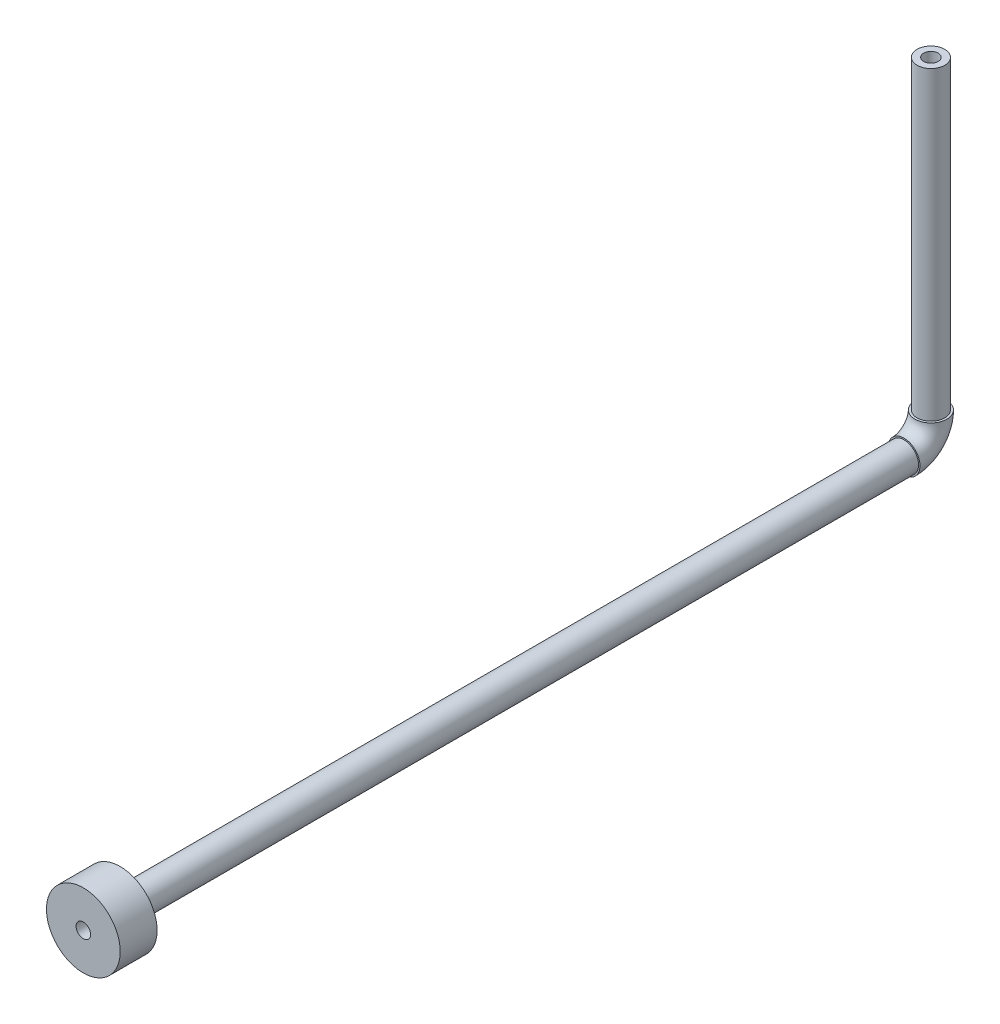
ISO-10303-21;
HEADER;
FILE_DESCRIPTION(('STEP AP214'),'2;1');
FILE_NAME('part.step','',(''),(''),'','','');
FILE_SCHEMA(('AUTOMOTIVE_DESIGN { 1 0 10303 214 1 1 1 1 }'));
ENDSEC;
DATA;
#1=APPLICATION_CONTEXT('core data for automotive mechanical design processes');
#2=APPLICATION_PROTOCOL_DEFINITION('international standard','automotive_design',2000,#1);
#3=PRODUCT_CONTEXT('',#1,'mechanical');
#4=PRODUCT('Part','Part','',(#3));
#5=PRODUCT_RELATED_PRODUCT_CATEGORY('part','',(#4));
#6=PRODUCT_DEFINITION_FORMATION('','',#4);
#7=PRODUCT_DEFINITION_CONTEXT('part definition',#1,'design');
#8=PRODUCT_DEFINITION('design','',#6,#7);
#9=PRODUCT_DEFINITION_SHAPE('','',#8);
#10=(LENGTH_UNIT() NAMED_UNIT(*) SI_UNIT(.MILLI.,.METRE.));
#11=(NAMED_UNIT(*) PLANE_ANGLE_UNIT() SI_UNIT($,.RADIAN.));
#12=(NAMED_UNIT(*) SI_UNIT($,.STERADIAN.) SOLID_ANGLE_UNIT());
#13=UNCERTAINTY_MEASURE_WITH_UNIT(LENGTH_MEASURE(1.E-05),#10,'distance_accuracy_value','');
#14=(GEOMETRIC_REPRESENTATION_CONTEXT(3) GLOBAL_UNCERTAINTY_ASSIGNED_CONTEXT((#13)) GLOBAL_UNIT_ASSIGNED_CONTEXT((#10,
#11,#12)) REPRESENTATION_CONTEXT('',''));
#15=CARTESIAN_POINT('',(0.,0.,0.));
#16=DIRECTION('',(0.,0.,1.));
#17=DIRECTION('',(1.,0.,0.));
#18=AXIS2_PLACEMENT_3D('',#15,#16,#17);
#19=CARTESIAN_POINT('',(563.692704421741,240.987141462231,-291.844137163047));
#20=DIRECTION('',(0.,1.,0.));
#21=DIRECTION('',(-1.,0.,0.));
#22=AXIS2_PLACEMENT_3D('',#19,#20,#21);
#23=PLANE('',#22);
#24=CARTESIAN_POINT('',(563.692704421741,240.987141462231,-291.844137163047));
#25=DIRECTION('',(0.,1.,0.));
#26=DIRECTION('',(-1.,0.,0.));
#27=AXIS2_PLACEMENT_3D('',#24,#25,#26);
#28=CIRCLE('',#27,5.49999999999996);
#29=CARTESIAN_POINT('',(563.692704421741,240.987141462231,-297.344137163047));
#30=VERTEX_POINT('',#29);
#31=EDGE_CURVE('E55',#30,#30,#28,.T.);
#32=ORIENTED_EDGE('',*,*,#31,.T.);
#33=EDGE_LOOP('',(#32));
#34=FACE_BOUND('',#33,.T.);
#35=CARTESIAN_POINT('',(563.692704421741,240.987141462233,-291.844137163047));
#36=DIRECTION('',(0.,1.,0.));
#37=DIRECTION('',(0.,0.,1.));
#38=AXIS2_PLACEMENT_3D('',#35,#36,#37);
#39=CIRCLE('',#38,4.76250000000001);
#40=CARTESIAN_POINT('',(563.692704421741,240.987141462233,-287.081637163047));
#41=VERTEX_POINT('',#40);
#42=EDGE_CURVE('E69',#41,#41,#39,.T.);
#43=ORIENTED_EDGE('',*,*,#42,.F.);
#44=EDGE_LOOP('',(#43));
#45=FACE_BOUND('',#44,.T.);
#46=ADVANCED_FACE('F35',(#34,#45),#23,.T.);
#47=CARTESIAN_POINT('',(563.692704421741,231.718004299184,-12.7));
#48=DIRECTION('',(0.,0.,1.));
#49=DIRECTION('',(1.,0.,0.));
#50=AXIS2_PLACEMENT_3D('',#47,#48,#49);
#51=CYLINDRICAL_SURFACE('',#50,12.7);
#52=CARTESIAN_POINT('',(563.692704421741,231.718004299184,-12.7));
#53=DIRECTION('',(0.,0.,1.));
#54=DIRECTION('',(1.,0.,0.));
#55=AXIS2_PLACEMENT_3D('',#52,#53,#54);
#56=CIRCLE('',#55,12.7);
#57=CARTESIAN_POINT('',(576.392704421741,231.718004299184,-12.7));
#58=VERTEX_POINT('',#57);
#59=EDGE_CURVE('E10',#58,#58,#56,.T.);
#60=ORIENTED_EDGE('',*,*,#59,.T.);
#61=EDGE_LOOP('',(#60));
#62=FACE_BOUND('',#61,.T.);
#63=CARTESIAN_POINT('',(563.692704421741,231.718004299184,0.));
#64=DIRECTION('',(0.,0.,1.));
#65=DIRECTION('',(1.,0.,0.));
#66=AXIS2_PLACEMENT_3D('',#63,#64,#65);
#67=CIRCLE('',#66,12.7);
#68=CARTESIAN_POINT('',(576.392704421741,231.718004299184,0.));
#69=VERTEX_POINT('',#68);
#70=EDGE_CURVE('E39',#69,#69,#67,.T.);
#71=ORIENTED_EDGE('',*,*,#70,.F.);
#72=EDGE_LOOP('',(#71));
#73=FACE_BOUND('',#72,.T.);
#74=ADVANCED_FACE('F37',(#62,#73),#51,.T.);
#75=CARTESIAN_POINT('',(563.692704421741,231.718004299184,-12.7));
#76=DIRECTION('',(0.,0.,1.));
#77=DIRECTION('',(1.,0.,0.));
#78=AXIS2_PLACEMENT_3D('',#75,#76,#77);
#79=PLANE('',#78);
#80=CARTESIAN_POINT('',(563.692704421741,231.718004299184,-12.7));
#81=DIRECTION('',(0.,0.,1.));
#82=DIRECTION('',(1.,0.,0.));
#83=AXIS2_PLACEMENT_3D('',#80,#81,#82);
#84=CIRCLE('',#83,5.00000000000005);
#85=CARTESIAN_POINT('',(568.692704421741,231.718004299184,-12.7));
#86=VERTEX_POINT('',#85);
#87=EDGE_CURVE('E46',#86,#86,#84,.T.);
#88=ORIENTED_EDGE('',*,*,#87,.T.);
#89=EDGE_LOOP('',(#88));
#90=FACE_BOUND('',#89,.T.);
#91=ORIENTED_EDGE('',*,*,#59,.F.);
#92=EDGE_LOOP('',(#91));
#93=FACE_BOUND('',#92,.T.);
#94=ADVANCED_FACE('F103',(#90,#93),#79,.F.);
#95=CARTESIAN_POINT('',(563.692704421741,231.718004299184,0.));
#96=DIRECTION('',(0.,0.,1.));
#97=DIRECTION('',(1.,0.,0.));
#98=AXIS2_PLACEMENT_3D('',#95,#96,#97);
#99=PLANE('',#98);
#100=ORIENTED_EDGE('',*,*,#70,.T.);
#101=EDGE_LOOP('',(#100));
#102=FACE_BOUND('',#101,.T.);
#103=CARTESIAN_POINT('',(563.692704421741,231.718004299184,0.));
#104=DIRECTION('',(0.,0.,1.));
#105=DIRECTION('',(1.,0.,0.));
#106=AXIS2_PLACEMENT_3D('',#103,#104,#105);
#107=CIRCLE('',#106,2.49999999999992);
#108=CARTESIAN_POINT('',(566.192704421741,231.718004299184,0.));
#109=VERTEX_POINT('',#108);
#110=EDGE_CURVE('E54',#109,#109,#107,.T.);
#111=ORIENTED_EDGE('',*,*,#110,.F.);
#112=EDGE_LOOP('',(#111));
#113=FACE_BOUND('',#112,.T.);
#114=ADVANCED_FACE('F120',(#102,#113),#99,.T.);
#115=CARTESIAN_POINT('',(563.692704421741,231.718004299184,-282.575));
#116=DIRECTION('',(0.,0.,1.));
#117=DIRECTION('',(1.,0.,0.));
#118=AXIS2_PLACEMENT_3D('',#115,#116,#117);
#119=CYLINDRICAL_SURFACE('',#118,5.00000000000005);
#120=CARTESIAN_POINT('',(563.692704421741,231.718004299184,-282.575));
#121=DIRECTION('',(0.,0.,1.));
#122=DIRECTION('',(1.,0.,0.));
#123=AXIS2_PLACEMENT_3D('',#120,#121,#122);
#124=CIRCLE('',#123,5.00000000000005);
#125=CARTESIAN_POINT('',(568.692704421741,231.718004299184,-282.575));
#126=VERTEX_POINT('',#125);
#127=EDGE_CURVE('E51',#126,#126,#124,.T.);
#128=ORIENTED_EDGE('',*,*,#127,.T.);
#129=EDGE_LOOP('',(#128));
#130=FACE_BOUND('',#129,.T.);
#131=ORIENTED_EDGE('',*,*,#87,.F.);
#132=EDGE_LOOP('',(#131));
#133=FACE_BOUND('',#132,.T.);
#134=ADVANCED_FACE('F116',(#130,#133),#119,.T.);
#135=CARTESIAN_POINT('',(563.692704421741,231.718004299184,-282.575));
#136=DIRECTION('',(0.,0.,1.));
#137=DIRECTION('',(1.,0.,0.));
#138=AXIS2_PLACEMENT_3D('',#135,#136,#137);
#139=CYLINDRICAL_SURFACE('',#138,2.49999999999992);
#140=CARTESIAN_POINT('',(563.692704421741,231.718004299184,-282.575));
#141=DIRECTION('',(0.,0.,1.));
#142=DIRECTION('',(1.,0.,0.));
#143=AXIS2_PLACEMENT_3D('',#140,#141,#142);
#144=CIRCLE('',#143,2.49999999999992);
#145=CARTESIAN_POINT('',(563.692704421741,229.218004299184,-282.575));
#146=VERTEX_POINT('',#145);
#147=EDGE_CURVE('E50',#146,#146,#144,.T.);
#148=ORIENTED_EDGE('',*,*,#147,.F.);
#149=EDGE_LOOP('',(#148));
#150=FACE_BOUND('',#149,.T.);
#151=ORIENTED_EDGE('',*,*,#110,.T.);
#152=EDGE_LOOP('',(#151));
#153=FACE_BOUND('',#152,.T.);
#154=ADVANCED_FACE('F109',(#150,#153),#139,.F.);
#155=CARTESIAN_POINT('',(563.692704421741,240.987141462231,-282.575));
#156=DIRECTION('',(-1.,0.,0.));
#157=DIRECTION('',(0.,0.,1.));
#158=AXIS2_PLACEMENT_3D('',#155,#156,#157);
#159=TOROIDAL_SURFACE('',#158,9.26913716304678,2.49999999999992);
#160=CARTESIAN_POINT('',(563.692704421741,240.987141462231,-291.844137163047));
#161=DIRECTION('',(0.,1.,0.));
#162=DIRECTION('',(-1.,0.,0.));
#163=AXIS2_PLACEMENT_3D('',#160,#161,#162);
#164=CIRCLE('',#163,2.49999999999992);
#165=CARTESIAN_POINT('',(563.692704421741,240.987141462231,-294.344137163047));
#166=VERTEX_POINT('',#165);
#167=EDGE_CURVE('E62',#166,#166,#164,.T.);
#168=CARTESIAN_POINT('',(563.692704421741,240.987141462231,-282.575));
#169=DIRECTION('',(-1.,0.,0.));
#170=DIRECTION('',(0.,0.,1.));
#171=AXIS2_PLACEMENT_3D('',#168,#169,#170);
#172=CIRCLE('',#171,11.7691371630467);
#173=EDGE_CURVE('',#166,#146,#172,.T.);
#174=ORIENTED_EDGE('',*,*,#167,.T.);
#175=ORIENTED_EDGE('',*,*,#147,.T.);
#176=ORIENTED_EDGE('',*,*,#173,.T.);
#177=ORIENTED_EDGE('',*,*,#173,.F.);
#178=EDGE_LOOP('',(#174,#176,#175,#177));
#179=FACE_BOUND('',#178,.T.);
#180=ADVANCED_FACE('F106',(#179),#159,.F.);
#181=CARTESIAN_POINT('',(563.692704421741,240.987141462231,-282.575));
#182=DIRECTION('',(-1.,0.,0.));
#183=DIRECTION('',(0.,0.,1.));
#184=AXIS2_PLACEMENT_3D('',#181,#182,#183);
#185=TOROIDAL_SURFACE('',#184,9.26913716304678,5.49999999999996);
#186=CARTESIAN_POINT('',(563.692704421741,231.718004299184,-282.575));
#187=DIRECTION('',(0.,0.,-1.));
#188=DIRECTION('',(-1.,0.,0.));
#189=AXIS2_PLACEMENT_3D('',#186,#187,#188);
#190=CIRCLE('',#189,5.49999999999996);
#191=CARTESIAN_POINT('',(563.692704421741,226.218004299184,-282.575));
#192=VERTEX_POINT('',#191);
#193=EDGE_CURVE('E65',#192,#192,#190,.T.);
#194=CARTESIAN_POINT('',(563.692704421741,240.987141462231,-282.575));
#195=DIRECTION('',(-1.,0.,0.));
#196=DIRECTION('',(0.,0.,1.));
#197=AXIS2_PLACEMENT_3D('',#194,#195,#196);
#198=CIRCLE('',#197,14.7691371630467);
#199=EDGE_CURVE('',#30,#192,#198,.T.);
#200=ORIENTED_EDGE('',*,*,#31,.F.);
#201=ORIENTED_EDGE('',*,*,#193,.T.);
#202=ORIENTED_EDGE('',*,*,#199,.T.);
#203=ORIENTED_EDGE('',*,*,#199,.F.);
#204=EDGE_LOOP('',(#200,#202,#201,#203));
#205=FACE_BOUND('',#204,.T.);
#206=ADVANCED_FACE('F93',(#205),#185,.T.);
#207=CARTESIAN_POINT('',(563.692704421741,231.718004299184,-282.575));
#208=DIRECTION('',(0.,0.,-1.));
#209=DIRECTION('',(-1.,0.,0.));
#210=AXIS2_PLACEMENT_3D('',#207,#208,#209);
#211=PLANE('',#210);
#212=ORIENTED_EDGE('',*,*,#127,.F.);
#213=EDGE_LOOP('',(#212));
#214=FACE_BOUND('',#213,.T.);
#215=ORIENTED_EDGE('',*,*,#193,.F.);
#216=EDGE_LOOP('',(#215));
#217=FACE_BOUND('',#216,.T.);
#218=ADVANCED_FACE('F84',(#214,#217),#211,.F.);
#219=CARTESIAN_POINT('',(563.692704421741,346.143141462233,-291.844137163047));
#220=DIRECTION('',(0.,1.,0.));
#221=DIRECTION('',(0.,0.,1.));
#222=AXIS2_PLACEMENT_3D('',#219,#220,#221);
#223=PLANE('',#222);
#224=CARTESIAN_POINT('',(563.692704421741,346.143141462233,-291.844137163047));
#225=DIRECTION('',(0.,1.,0.));
#226=DIRECTION('',(0.,0.,1.));
#227=AXIS2_PLACEMENT_3D('',#224,#225,#226);
#228=CIRCLE('',#227,4.76250000000001);
#229=CARTESIAN_POINT('',(563.692704421741,346.143141462233,-287.081637163047));
#230=VERTEX_POINT('',#229);
#231=EDGE_CURVE('E68',#230,#230,#228,.T.);
#232=ORIENTED_EDGE('',*,*,#231,.T.);
#233=EDGE_LOOP('',(#232));
#234=FACE_BOUND('',#233,.T.);
#235=CARTESIAN_POINT('',(563.692704421741,346.143141462233,-291.844137163047));
#236=DIRECTION('',(0.,1.,0.));
#237=DIRECTION('',(0.,0.,1.));
#238=AXIS2_PLACEMENT_3D('',#235,#236,#237);
#239=CIRCLE('',#238,2.49999999999992);
#240=CARTESIAN_POINT('',(563.692704421741,346.143141462233,-289.344137163047));
#241=VERTEX_POINT('',#240);
#242=EDGE_CURVE('E72',#241,#241,#239,.T.);
#243=ORIENTED_EDGE('',*,*,#242,.F.);
#244=EDGE_LOOP('',(#243));
#245=FACE_BOUND('',#244,.T.);
#246=ADVANCED_FACE('F81',(#234,#245),#223,.T.);
#247=CARTESIAN_POINT('',(563.692704421741,346.143141462233,-291.844137163047));
#248=DIRECTION('',(0.,-1.,0.));
#249=DIRECTION('',(0.,0.,-1.));
#250=AXIS2_PLACEMENT_3D('',#247,#248,#249);
#251=CYLINDRICAL_SURFACE('',#250,4.76250000000001);
#252=ORIENTED_EDGE('',*,*,#231,.F.);
#253=EDGE_LOOP('',(#252));
#254=FACE_BOUND('',#253,.T.);
#255=ORIENTED_EDGE('',*,*,#42,.T.);
#256=EDGE_LOOP('',(#255));
#257=FACE_BOUND('',#256,.T.);
#258=ADVANCED_FACE('F83',(#254,#257),#251,.T.);
#259=CARTESIAN_POINT('',(563.692704421741,346.143141462233,-291.844137163047));
#260=DIRECTION('',(0.,-1.,0.));
#261=DIRECTION('',(0.,0.,-1.));
#262=AXIS2_PLACEMENT_3D('',#259,#260,#261);
#263=CYLINDRICAL_SURFACE('',#262,2.49999999999992);
#264=ORIENTED_EDGE('',*,*,#242,.T.);
#265=EDGE_LOOP('',(#264));
#266=FACE_BOUND('',#265,.T.);
#267=ORIENTED_EDGE('',*,*,#167,.F.);
#268=EDGE_LOOP('',(#267));
#269=FACE_BOUND('',#268,.T.);
#270=ADVANCED_FACE('F78',(#266,#269),#263,.F.);
#271=CLOSED_SHELL('',(#46,#74,#94,#114,#134,#154,#180,#206,#218,#246,#258,#270));
#272=MANIFOLD_SOLID_BREP('B2',#271);
#273=ADVANCED_BREP_SHAPE_REPRESENTATION('',(#18,#272),#14);
#274=SHAPE_DEFINITION_REPRESENTATION(#9,#273);
ENDSEC;
END-ISO-10303-21;
